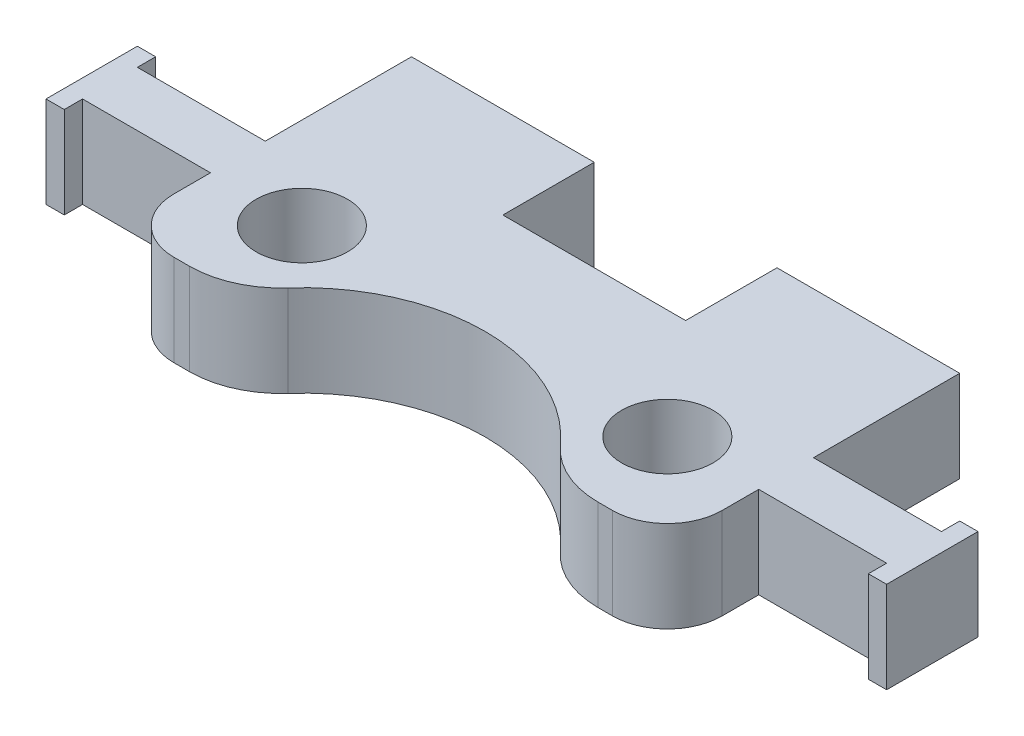
ISO-10303-21;
HEADER;
FILE_DESCRIPTION(('STEP AP214'),'2;1');
FILE_NAME('part.step','',(''),(''),'','','');
FILE_SCHEMA(('AUTOMOTIVE_DESIGN { 1 0 10303 214 1 1 1 1 }'));
ENDSEC;
DATA;
#1=APPLICATION_CONTEXT('core data for automotive mechanical design processes');
#2=APPLICATION_PROTOCOL_DEFINITION('international standard','automotive_design',2000,#1);
#3=PRODUCT_CONTEXT('',#1,'mechanical');
#4=PRODUCT('Part','Part','',(#3));
#5=PRODUCT_RELATED_PRODUCT_CATEGORY('part','',(#4));
#6=PRODUCT_DEFINITION_FORMATION('','',#4);
#7=PRODUCT_DEFINITION_CONTEXT('part definition',#1,'design');
#8=PRODUCT_DEFINITION('design','',#6,#7);
#9=PRODUCT_DEFINITION_SHAPE('','',#8);
#10=(LENGTH_UNIT() NAMED_UNIT(*) SI_UNIT(.MILLI.,.METRE.));
#11=(NAMED_UNIT(*) PLANE_ANGLE_UNIT() SI_UNIT($,.RADIAN.));
#12=(NAMED_UNIT(*) SI_UNIT($,.STERADIAN.) SOLID_ANGLE_UNIT());
#13=UNCERTAINTY_MEASURE_WITH_UNIT(LENGTH_MEASURE(1.E-05),#10,'distance_accuracy_value','');
#14=(GEOMETRIC_REPRESENTATION_CONTEXT(3) GLOBAL_UNCERTAINTY_ASSIGNED_CONTEXT((#13)) GLOBAL_UNIT_ASSIGNED_CONTEXT((#10,
#11,#12)) REPRESENTATION_CONTEXT('',''));
#15=CARTESIAN_POINT('',(0.,0.,0.));
#16=DIRECTION('',(0.,0.,1.));
#17=DIRECTION('',(1.,0.,0.));
#18=AXIS2_PLACEMENT_3D('',#15,#16,#17);
#19=CARTESIAN_POINT('',(3.,5.,-8.));
#20=DIRECTION('',(0.,-1.,0.));
#21=DIRECTION('',(0.,0.,-1.));
#22=AXIS2_PLACEMENT_3D('',#19,#20,#21);
#23=PLANE('',#22);
#24=DIRECTION('',(0.,0.,-1.));
#25=VECTOR('',#24,1.);
#26=CARTESIAN_POINT('',(30.,5.,-13.));
#27=LINE('',#26,#25);
#28=CARTESIAN_POINT('',(30.,5.,-13.));
#29=VERTEX_POINT('',#28);
#30=CARTESIAN_POINT('',(30.,5.,-21.));
#31=VERTEX_POINT('',#30);
#32=EDGE_CURVE('E323',#29,#31,#27,.T.);
#33=ORIENTED_EDGE('',*,*,#32,.T.);
#34=DIRECTION('',(-1.,0.,0.));
#35=VECTOR('',#34,1.);
#36=CARTESIAN_POINT('',(20.,5.,-21.));
#37=LINE('',#36,#35);
#38=CARTESIAN_POINT('',(20.,5.,-21.));
#39=VERTEX_POINT('',#38);
#40=EDGE_CURVE('E161',#31,#39,#37,.T.);
#41=ORIENTED_EDGE('',*,*,#40,.T.);
#42=DIRECTION('',(0.,0.,1.));
#43=VECTOR('',#42,1.);
#44=CARTESIAN_POINT('',(20.,5.,-21.));
#45=LINE('',#44,#43);
#46=CARTESIAN_POINT('',(20.,5.,-16.));
#47=VERTEX_POINT('',#46);
#48=EDGE_CURVE('E404',#39,#47,#45,.T.);
#49=ORIENTED_EDGE('',*,*,#48,.T.);
#50=DIRECTION('',(-1.,0.,0.));
#51=VECTOR('',#50,1.);
#52=CARTESIAN_POINT('',(10.,5.,-16.));
#53=LINE('',#52,#51);
#54=CARTESIAN_POINT('',(10.,5.,-16.));
#55=VERTEX_POINT('',#54);
#56=EDGE_CURVE('E423',#47,#55,#53,.T.);
#57=ORIENTED_EDGE('',*,*,#56,.T.);
#58=DIRECTION('',(0.,0.,-1.));
#59=VECTOR('',#58,1.);
#60=CARTESIAN_POINT('',(10.,5.,-21.));
#61=LINE('',#60,#59);
#62=CARTESIAN_POINT('',(10.,5.,-21.));
#63=VERTEX_POINT('',#62);
#64=EDGE_CURVE('E420',#55,#63,#61,.T.);
#65=ORIENTED_EDGE('',*,*,#64,.T.);
#66=DIRECTION('',(-1.,0.,0.));
#67=VECTOR('',#66,1.);
#68=CARTESIAN_POINT('',(0.,5.,-21.));
#69=LINE('',#68,#67);
#70=CARTESIAN_POINT('',(0.,5.,-21.));
#71=VERTEX_POINT('',#70);
#72=EDGE_CURVE('E422',#63,#71,#69,.T.);
#73=ORIENTED_EDGE('',*,*,#72,.T.);
#74=DIRECTION('',(0.,0.,1.));
#75=VECTOR('',#74,1.);
#76=CARTESIAN_POINT('',(0.,5.,-13.));
#77=LINE('',#76,#75);
#78=CARTESIAN_POINT('',(0.,5.,-13.));
#79=VERTEX_POINT('',#78);
#80=EDGE_CURVE('E425',#71,#79,#77,.T.);
#81=ORIENTED_EDGE('',*,*,#80,.T.);
#82=DIRECTION('',(-1.,0.,0.));
#83=VECTOR('',#82,1.);
#84=CARTESIAN_POINT('',(-7.,5.,-13.));
#85=LINE('',#84,#83);
#86=CARTESIAN_POINT('',(-7.,5.,-13.));
#87=VERTEX_POINT('',#86);
#88=EDGE_CURVE('E431',#79,#87,#85,.T.);
#89=ORIENTED_EDGE('',*,*,#88,.T.);
#90=DIRECTION('',(0.,0.,-1.));
#91=VECTOR('',#90,1.);
#92=CARTESIAN_POINT('',(-7.,5.,-14.));
#93=LINE('',#92,#91);
#94=CARTESIAN_POINT('',(-7.,5.,-14.));
#95=VERTEX_POINT('',#94);
#96=EDGE_CURVE('E433',#87,#95,#93,.T.);
#97=ORIENTED_EDGE('',*,*,#96,.T.);
#98=DIRECTION('',(-1.,0.,0.));
#99=VECTOR('',#98,1.);
#100=CARTESIAN_POINT('',(-8.,5.,-14.));
#101=LINE('',#100,#99);
#102=CARTESIAN_POINT('',(-8.,5.,-14.));
#103=VERTEX_POINT('',#102);
#104=EDGE_CURVE('E435',#95,#103,#101,.T.);
#105=ORIENTED_EDGE('',*,*,#104,.T.);
#106=DIRECTION('',(0.,0.,1.));
#107=VECTOR('',#106,1.);
#108=CARTESIAN_POINT('',(-8.,5.,-9.));
#109=LINE('',#108,#107);
#110=CARTESIAN_POINT('',(-8.,5.,-9.));
#111=VERTEX_POINT('',#110);
#112=EDGE_CURVE('E437',#103,#111,#109,.T.);
#113=ORIENTED_EDGE('',*,*,#112,.T.);
#114=DIRECTION('',(1.,0.,0.));
#115=VECTOR('',#114,1.);
#116=CARTESIAN_POINT('',(-7.,5.,-9.));
#117=LINE('',#116,#115);
#118=CARTESIAN_POINT('',(-7.,5.,-9.));
#119=VERTEX_POINT('',#118);
#120=EDGE_CURVE('E439',#111,#119,#117,.T.);
#121=ORIENTED_EDGE('',*,*,#120,.T.);
#122=DIRECTION('',(0.,0.,-1.));
#123=VECTOR('',#122,1.);
#124=CARTESIAN_POINT('',(-7.,5.,-10.));
#125=LINE('',#124,#123);
#126=CARTESIAN_POINT('',(-7.,5.,-10.));
#127=VERTEX_POINT('',#126);
#128=EDGE_CURVE('E441',#119,#127,#125,.T.);
#129=ORIENTED_EDGE('',*,*,#128,.T.);
#130=DIRECTION('',(1.,0.,0.));
#131=VECTOR('',#130,1.);
#132=CARTESIAN_POINT('',(0.,5.,-10.));
#133=LINE('',#132,#131);
#134=CARTESIAN_POINT('',(0.,5.,-10.));
#135=VERTEX_POINT('',#134);
#136=EDGE_CURVE('E443',#127,#135,#133,.T.);
#137=ORIENTED_EDGE('',*,*,#136,.T.);
#138=DIRECTION('',(0.,0.,1.));
#139=VECTOR('',#138,1.);
#140=CARTESIAN_POINT('',(0.,5.,-8.00000000000002));
#141=LINE('',#140,#139);
#142=CARTESIAN_POINT('',(0.,5.,-8.00000000000002));
#143=VERTEX_POINT('',#142);
#144=EDGE_CURVE('E445',#135,#143,#141,.T.);
#145=ORIENTED_EDGE('',*,*,#144,.T.);
#146=CARTESIAN_POINT('',(3.,5.,-8.));
#147=DIRECTION('',(0.,1.,0.));
#148=DIRECTION('',(0.,0.,-1.));
#149=AXIS2_PLACEMENT_3D('',#146,#147,#148);
#150=CIRCLE('',#149,3.);
#151=CARTESIAN_POINT('',(3.00000000000002,5.,-5.));
#152=VERTEX_POINT('',#151);
#153=EDGE_CURVE('E447',#143,#152,#150,.T.);
#154=ORIENTED_EDGE('',*,*,#153,.T.);
#155=DIRECTION('',(1.,0.,0.));
#156=VECTOR('',#155,1.);
#157=CARTESIAN_POINT('',(3.00000000000002,5.,-5.));
#158=LINE('',#157,#156);
#159=CARTESIAN_POINT('',(3.8456798179791,5.,-5.));
#160=VERTEX_POINT('',#159);
#161=EDGE_CURVE('E449',#152,#160,#158,.T.);
#162=ORIENTED_EDGE('',*,*,#161,.T.);
#163=CARTESIAN_POINT('',(3.8456798179791,5.,-10.));
#164=DIRECTION('',(0.,1.,0.));
#165=DIRECTION('',(0.,0.,1.));
#166=AXIS2_PLACEMENT_3D('',#163,#164,#165);
#167=CIRCLE('',#166,5.);
#168=CARTESIAN_POINT('',(7.57245978047875,5.,-6.66666666666666));
#169=VERTEX_POINT('',#168);
#170=EDGE_CURVE('E451',#160,#169,#167,.T.);
#171=ORIENTED_EDGE('',*,*,#170,.T.);
#172=CARTESIAN_POINT('',(15.0260197054781,5.,0.));
#173=DIRECTION('',(0.,-1.,0.));
#174=DIRECTION('',(0.,0.,1.));
#175=AXIS2_PLACEMENT_3D('',#172,#173,#174);
#176=CIRCLE('',#175,10.);
#177=CARTESIAN_POINT('',(22.4795796304774,5.,-6.66666666666666));
#178=VERTEX_POINT('',#177);
#179=EDGE_CURVE('E453',#169,#178,#176,.T.);
#180=ORIENTED_EDGE('',*,*,#179,.T.);
#181=CARTESIAN_POINT('',(26.206359592977,5.,-10.));
#182=DIRECTION('',(0.,1.,0.));
#183=DIRECTION('',(0.,0.,-1.));
#184=AXIS2_PLACEMENT_3D('',#181,#182,#183);
#185=CIRCLE('',#184,5.);
#186=CARTESIAN_POINT('',(26.206359592977,5.,-5.));
#187=VERTEX_POINT('',#186);
#188=EDGE_CURVE('E455',#178,#187,#185,.T.);
#189=ORIENTED_EDGE('',*,*,#188,.T.);
#190=DIRECTION('',(1.,0.,0.));
#191=VECTOR('',#190,1.);
#192=CARTESIAN_POINT('',(26.206359592977,5.,-5.));
#193=LINE('',#192,#191);
#194=CARTESIAN_POINT('',(27.,5.,-5.));
#195=VERTEX_POINT('',#194);
#196=EDGE_CURVE('E457',#187,#195,#193,.T.);
#197=ORIENTED_EDGE('',*,*,#196,.T.);
#198=CARTESIAN_POINT('',(27.,5.,-8.));
#199=DIRECTION('',(0.,1.,0.));
#200=DIRECTION('',(0.,0.,1.));
#201=AXIS2_PLACEMENT_3D('',#198,#199,#200);
#202=CIRCLE('',#201,3.);
#203=CARTESIAN_POINT('',(30.,5.,-8.00000000000002));
#204=VERTEX_POINT('',#203);
#205=EDGE_CURVE('E459',#195,#204,#202,.T.);
#206=ORIENTED_EDGE('',*,*,#205,.T.);
#207=DIRECTION('',(0.,0.,-1.));
#208=VECTOR('',#207,1.);
#209=CARTESIAN_POINT('',(30.,5.,-8.00000000000002));
#210=LINE('',#209,#208);
#211=CARTESIAN_POINT('',(30.,5.,-10.));
#212=VERTEX_POINT('',#211);
#213=EDGE_CURVE('E461',#204,#212,#210,.T.);
#214=ORIENTED_EDGE('',*,*,#213,.T.);
#215=DIRECTION('',(1.,0.,0.));
#216=VECTOR('',#215,1.);
#217=CARTESIAN_POINT('',(30.,5.,-10.));
#218=LINE('',#217,#216);
#219=CARTESIAN_POINT('',(37.,5.,-10.));
#220=VERTEX_POINT('',#219);
#221=EDGE_CURVE('E463',#212,#220,#218,.T.);
#222=ORIENTED_EDGE('',*,*,#221,.T.);
#223=DIRECTION('',(0.,0.,1.));
#224=VECTOR('',#223,1.);
#225=CARTESIAN_POINT('',(37.,5.,-10.));
#226=LINE('',#225,#224);
#227=CARTESIAN_POINT('',(37.,5.,-9.));
#228=VERTEX_POINT('',#227);
#229=EDGE_CURVE('E465',#220,#228,#226,.T.);
#230=ORIENTED_EDGE('',*,*,#229,.T.);
#231=DIRECTION('',(1.,0.,0.));
#232=VECTOR('',#231,1.);
#233=CARTESIAN_POINT('',(37.,5.,-9.));
#234=LINE('',#233,#232);
#235=CARTESIAN_POINT('',(38.,5.,-9.));
#236=VERTEX_POINT('',#235);
#237=EDGE_CURVE('E467',#228,#236,#234,.T.);
#238=ORIENTED_EDGE('',*,*,#237,.T.);
#239=DIRECTION('',(0.,0.,-1.));
#240=VECTOR('',#239,1.);
#241=CARTESIAN_POINT('',(38.,5.,-9.));
#242=LINE('',#241,#240);
#243=CARTESIAN_POINT('',(38.,5.,-14.));
#244=VERTEX_POINT('',#243);
#245=EDGE_CURVE('E246',#236,#244,#242,.T.);
#246=ORIENTED_EDGE('',*,*,#245,.T.);
#247=DIRECTION('',(-1.,0.,0.));
#248=VECTOR('',#247,1.);
#249=CARTESIAN_POINT('',(38.,5.,-14.));
#250=LINE('',#249,#248);
#251=CARTESIAN_POINT('',(37.,5.,-14.));
#252=VERTEX_POINT('',#251);
#253=EDGE_CURVE('E240',#244,#252,#250,.T.);
#254=ORIENTED_EDGE('',*,*,#253,.T.);
#255=DIRECTION('',(0.,0.,1.));
#256=VECTOR('',#255,1.);
#257=CARTESIAN_POINT('',(37.,5.,-14.));
#258=LINE('',#257,#256);
#259=CARTESIAN_POINT('',(37.,5.,-13.));
#260=VERTEX_POINT('',#259);
#261=EDGE_CURVE('E244',#252,#260,#258,.T.);
#262=ORIENTED_EDGE('',*,*,#261,.T.);
#263=DIRECTION('',(-1.,0.,0.));
#264=VECTOR('',#263,1.);
#265=CARTESIAN_POINT('',(37.,5.,-13.));
#266=LINE('',#265,#264);
#267=EDGE_CURVE('E52',#260,#29,#266,.T.);
#268=ORIENTED_EDGE('',*,*,#267,.T.);
#269=EDGE_LOOP('',(#33,#41,#49,#57,#65,#73,#81,#89,#97,#105,#113,#121,#129,#137,#145,#154,#162,
#171,#180,#189,#197,#206,#214,#222,#230,#238,#246,#254,#262,#268));
#270=FACE_BOUND('',#269,.T.);
#271=CARTESIAN_POINT('',(5.,5.,-10.));
#272=DIRECTION('',(0.,1.,0.));
#273=DIRECTION('',(0.,0.,1.));
#274=AXIS2_PLACEMENT_3D('',#271,#272,#273);
#275=CIRCLE('',#274,2.5);
#276=CARTESIAN_POINT('',(5.,5.,-7.5));
#277=VERTEX_POINT('',#276);
#278=EDGE_CURVE('E268',#277,#277,#275,.T.);
#279=ORIENTED_EDGE('',*,*,#278,.F.);
#280=EDGE_LOOP('',(#279));
#281=FACE_BOUND('',#280,.T.);
#282=CARTESIAN_POINT('',(25.,5.,-10.));
#283=DIRECTION('',(0.,1.,0.));
#284=DIRECTION('',(0.,0.,1.));
#285=AXIS2_PLACEMENT_3D('',#282,#283,#284);
#286=CIRCLE('',#285,2.5);
#287=CARTESIAN_POINT('',(25.,5.,-7.5));
#288=VERTEX_POINT('',#287);
#289=EDGE_CURVE('E508',#288,#288,#286,.T.);
#290=ORIENTED_EDGE('',*,*,#289,.F.);
#291=EDGE_LOOP('',(#290));
#292=FACE_BOUND('',#291,.T.);
#293=ADVANCED_FACE('F35',(#270,#281,#292),#23,.F.);
#294=CARTESIAN_POINT('',(3.,0.,-8.));
#295=DIRECTION('',(0.,-1.,0.));
#296=DIRECTION('',(0.,0.,-1.));
#297=AXIS2_PLACEMENT_3D('',#294,#295,#296);
#298=PLANE('',#297);
#299=CARTESIAN_POINT('',(5.,0.,-10.));
#300=DIRECTION('',(0.,1.,0.));
#301=DIRECTION('',(0.,0.,1.));
#302=AXIS2_PLACEMENT_3D('',#299,#300,#301);
#303=CIRCLE('',#302,2.5);
#304=CARTESIAN_POINT('',(5.,0.,-7.5));
#305=VERTEX_POINT('',#304);
#306=EDGE_CURVE('E513',#305,#305,#303,.T.);
#307=ORIENTED_EDGE('',*,*,#306,.T.);
#308=EDGE_LOOP('',(#307));
#309=FACE_BOUND('',#308,.T.);
#310=DIRECTION('',(0.,0.,-1.));
#311=VECTOR('',#310,1.);
#312=CARTESIAN_POINT('',(30.,0.,-13.));
#313=LINE('',#312,#311);
#314=CARTESIAN_POINT('',(30.,0.,-13.));
#315=VERTEX_POINT('',#314);
#316=CARTESIAN_POINT('',(30.,0.,-21.));
#317=VERTEX_POINT('',#316);
#318=EDGE_CURVE('E264',#315,#317,#313,.T.);
#319=ORIENTED_EDGE('',*,*,#318,.F.);
#320=DIRECTION('',(-1.,0.,0.));
#321=VECTOR('',#320,1.);
#322=CARTESIAN_POINT('',(37.,0.,-13.));
#323=LINE('',#322,#321);
#324=CARTESIAN_POINT('',(37.,0.,-13.));
#325=VERTEX_POINT('',#324);
#326=EDGE_CURVE('E153',#325,#315,#323,.T.);
#327=ORIENTED_EDGE('',*,*,#326,.F.);
#328=DIRECTION('',(0.,0.,1.));
#329=VECTOR('',#328,1.);
#330=CARTESIAN_POINT('',(37.,0.,-14.));
#331=LINE('',#330,#329);
#332=CARTESIAN_POINT('',(37.,0.,-14.));
#333=VERTEX_POINT('',#332);
#334=EDGE_CURVE('E147',#333,#325,#331,.T.);
#335=ORIENTED_EDGE('',*,*,#334,.F.);
#336=DIRECTION('',(-1.,0.,0.));
#337=VECTOR('',#336,1.);
#338=CARTESIAN_POINT('',(38.,0.,-14.));
#339=LINE('',#338,#337);
#340=CARTESIAN_POINT('',(38.,0.,-14.));
#341=VERTEX_POINT('',#340);
#342=EDGE_CURVE('E254',#341,#333,#339,.T.);
#343=ORIENTED_EDGE('',*,*,#342,.F.);
#344=DIRECTION('',(0.,0.,-1.));
#345=VECTOR('',#344,1.);
#346=CARTESIAN_POINT('',(38.,0.,-9.));
#347=LINE('',#346,#345);
#348=CARTESIAN_POINT('',(38.,0.,-9.));
#349=VERTEX_POINT('',#348);
#350=EDGE_CURVE('E318',#349,#341,#347,.T.);
#351=ORIENTED_EDGE('',*,*,#350,.F.);
#352=DIRECTION('',(1.,0.,0.));
#353=VECTOR('',#352,1.);
#354=CARTESIAN_POINT('',(37.,0.,-9.));
#355=LINE('',#354,#353);
#356=CARTESIAN_POINT('',(37.,0.,-9.));
#357=VERTEX_POINT('',#356);
#358=EDGE_CURVE('E316',#357,#349,#355,.T.);
#359=ORIENTED_EDGE('',*,*,#358,.F.);
#360=DIRECTION('',(0.,0.,1.));
#361=VECTOR('',#360,1.);
#362=CARTESIAN_POINT('',(37.,0.,-10.));
#363=LINE('',#362,#361);
#364=CARTESIAN_POINT('',(37.,0.,-10.));
#365=VERTEX_POINT('',#364);
#366=EDGE_CURVE('E314',#365,#357,#363,.T.);
#367=ORIENTED_EDGE('',*,*,#366,.F.);
#368=DIRECTION('',(1.,0.,0.));
#369=VECTOR('',#368,1.);
#370=CARTESIAN_POINT('',(30.,0.,-10.));
#371=LINE('',#370,#369);
#372=CARTESIAN_POINT('',(30.,0.,-10.));
#373=VERTEX_POINT('',#372);
#374=EDGE_CURVE('E312',#373,#365,#371,.T.);
#375=ORIENTED_EDGE('',*,*,#374,.F.);
#376=DIRECTION('',(0.,0.,-1.));
#377=VECTOR('',#376,1.);
#378=CARTESIAN_POINT('',(30.,0.,-8.00000000000002));
#379=LINE('',#378,#377);
#380=CARTESIAN_POINT('',(30.,0.,-8.00000000000002));
#381=VERTEX_POINT('',#380);
#382=EDGE_CURVE('E310',#381,#373,#379,.T.);
#383=ORIENTED_EDGE('',*,*,#382,.F.);
#384=CARTESIAN_POINT('',(27.,0.,-8.));
#385=DIRECTION('',(0.,1.,0.));
#386=DIRECTION('',(0.,0.,1.));
#387=AXIS2_PLACEMENT_3D('',#384,#385,#386);
#388=CIRCLE('',#387,3.);
#389=CARTESIAN_POINT('',(27.,0.,-5.));
#390=VERTEX_POINT('',#389);
#391=EDGE_CURVE('E308',#390,#381,#388,.T.);
#392=ORIENTED_EDGE('',*,*,#391,.F.);
#393=DIRECTION('',(1.,0.,0.));
#394=VECTOR('',#393,1.);
#395=CARTESIAN_POINT('',(26.206359592977,0.,-5.));
#396=LINE('',#395,#394);
#397=CARTESIAN_POINT('',(26.206359592977,0.,-5.));
#398=VERTEX_POINT('',#397);
#399=EDGE_CURVE('E306',#398,#390,#396,.T.);
#400=ORIENTED_EDGE('',*,*,#399,.F.);
#401=CARTESIAN_POINT('',(26.206359592977,0.,-10.));
#402=DIRECTION('',(0.,1.,0.));
#403=DIRECTION('',(0.,0.,-1.));
#404=AXIS2_PLACEMENT_3D('',#401,#402,#403);
#405=CIRCLE('',#404,5.);
#406=CARTESIAN_POINT('',(22.4795796304774,0.,-6.66666666666666));
#407=VERTEX_POINT('',#406);
#408=EDGE_CURVE('E304',#407,#398,#405,.T.);
#409=ORIENTED_EDGE('',*,*,#408,.F.);
#410=CARTESIAN_POINT('',(15.0260197054781,0.,0.));
#411=DIRECTION('',(0.,-1.,0.));
#412=DIRECTION('',(0.,0.,1.));
#413=AXIS2_PLACEMENT_3D('',#410,#411,#412);
#414=CIRCLE('',#413,10.);
#415=CARTESIAN_POINT('',(7.57245978047875,0.,-6.66666666666666));
#416=VERTEX_POINT('',#415);
#417=EDGE_CURVE('E302',#416,#407,#414,.T.);
#418=ORIENTED_EDGE('',*,*,#417,.F.);
#419=CARTESIAN_POINT('',(3.8456798179791,0.,-10.));
#420=DIRECTION('',(0.,1.,0.));
#421=DIRECTION('',(0.,0.,1.));
#422=AXIS2_PLACEMENT_3D('',#419,#420,#421);
#423=CIRCLE('',#422,5.);
#424=CARTESIAN_POINT('',(3.8456798179791,0.,-5.));
#425=VERTEX_POINT('',#424);
#426=EDGE_CURVE('E300',#425,#416,#423,.T.);
#427=ORIENTED_EDGE('',*,*,#426,.F.);
#428=DIRECTION('',(1.,0.,0.));
#429=VECTOR('',#428,1.);
#430=CARTESIAN_POINT('',(3.00000000000002,0.,-5.));
#431=LINE('',#430,#429);
#432=CARTESIAN_POINT('',(3.00000000000002,0.,-5.));
#433=VERTEX_POINT('',#432);
#434=EDGE_CURVE('E298',#433,#425,#431,.T.);
#435=ORIENTED_EDGE('',*,*,#434,.F.);
#436=CARTESIAN_POINT('',(3.,0.,-8.));
#437=DIRECTION('',(0.,1.,0.));
#438=DIRECTION('',(0.,0.,-1.));
#439=AXIS2_PLACEMENT_3D('',#436,#437,#438);
#440=CIRCLE('',#439,3.);
#441=CARTESIAN_POINT('',(0.,0.,-8.00000000000002));
#442=VERTEX_POINT('',#441);
#443=EDGE_CURVE('E296',#442,#433,#440,.T.);
#444=ORIENTED_EDGE('',*,*,#443,.F.);
#445=DIRECTION('',(0.,0.,1.));
#446=VECTOR('',#445,1.);
#447=CARTESIAN_POINT('',(0.,0.,-8.00000000000002));
#448=LINE('',#447,#446);
#449=CARTESIAN_POINT('',(0.,0.,-10.));
#450=VERTEX_POINT('',#449);
#451=EDGE_CURVE('E294',#450,#442,#448,.T.);
#452=ORIENTED_EDGE('',*,*,#451,.F.);
#453=DIRECTION('',(1.,0.,0.));
#454=VECTOR('',#453,1.);
#455=CARTESIAN_POINT('',(0.,0.,-10.));
#456=LINE('',#455,#454);
#457=CARTESIAN_POINT('',(-7.,0.,-10.));
#458=VERTEX_POINT('',#457);
#459=EDGE_CURVE('E292',#458,#450,#456,.T.);
#460=ORIENTED_EDGE('',*,*,#459,.F.);
#461=DIRECTION('',(0.,0.,-1.));
#462=VECTOR('',#461,1.);
#463=CARTESIAN_POINT('',(-7.,0.,-10.));
#464=LINE('',#463,#462);
#465=CARTESIAN_POINT('',(-7.,0.,-9.));
#466=VERTEX_POINT('',#465);
#467=EDGE_CURVE('E290',#466,#458,#464,.T.);
#468=ORIENTED_EDGE('',*,*,#467,.F.);
#469=DIRECTION('',(1.,0.,0.));
#470=VECTOR('',#469,1.);
#471=CARTESIAN_POINT('',(-7.,0.,-9.));
#472=LINE('',#471,#470);
#473=CARTESIAN_POINT('',(-8.,0.,-9.));
#474=VERTEX_POINT('',#473);
#475=EDGE_CURVE('E288',#474,#466,#472,.T.);
#476=ORIENTED_EDGE('',*,*,#475,.F.);
#477=DIRECTION('',(0.,0.,1.));
#478=VECTOR('',#477,1.);
#479=CARTESIAN_POINT('',(-8.,0.,-9.));
#480=LINE('',#479,#478);
#481=CARTESIAN_POINT('',(-8.,0.,-14.));
#482=VERTEX_POINT('',#481);
#483=EDGE_CURVE('E286',#482,#474,#480,.T.);
#484=ORIENTED_EDGE('',*,*,#483,.F.);
#485=DIRECTION('',(-1.,0.,0.));
#486=VECTOR('',#485,1.);
#487=CARTESIAN_POINT('',(-8.,0.,-14.));
#488=LINE('',#487,#486);
#489=CARTESIAN_POINT('',(-7.,0.,-14.));
#490=VERTEX_POINT('',#489);
#491=EDGE_CURVE('E284',#490,#482,#488,.T.);
#492=ORIENTED_EDGE('',*,*,#491,.F.);
#493=DIRECTION('',(0.,0.,-1.));
#494=VECTOR('',#493,1.);
#495=CARTESIAN_POINT('',(-7.,0.,-14.));
#496=LINE('',#495,#494);
#497=CARTESIAN_POINT('',(-7.,0.,-13.));
#498=VERTEX_POINT('',#497);
#499=EDGE_CURVE('E282',#498,#490,#496,.T.);
#500=ORIENTED_EDGE('',*,*,#499,.F.);
#501=DIRECTION('',(-1.,0.,0.));
#502=VECTOR('',#501,1.);
#503=CARTESIAN_POINT('',(-7.,0.,-13.));
#504=LINE('',#503,#502);
#505=CARTESIAN_POINT('',(0.,0.,-13.));
#506=VERTEX_POINT('',#505);
#507=EDGE_CURVE('E280',#506,#498,#504,.T.);
#508=ORIENTED_EDGE('',*,*,#507,.F.);
#509=DIRECTION('',(0.,0.,1.));
#510=VECTOR('',#509,1.);
#511=CARTESIAN_POINT('',(0.,0.,-13.));
#512=LINE('',#511,#510);
#513=CARTESIAN_POINT('',(0.,0.,-21.));
#514=VERTEX_POINT('',#513);
#515=EDGE_CURVE('E278',#514,#506,#512,.T.);
#516=ORIENTED_EDGE('',*,*,#515,.F.);
#517=DIRECTION('',(-1.,0.,0.));
#518=VECTOR('',#517,1.);
#519=CARTESIAN_POINT('',(0.,0.,-21.));
#520=LINE('',#519,#518);
#521=CARTESIAN_POINT('',(10.,0.,-21.));
#522=VERTEX_POINT('',#521);
#523=EDGE_CURVE('E276',#522,#514,#520,.T.);
#524=ORIENTED_EDGE('',*,*,#523,.F.);
#525=DIRECTION('',(0.,0.,-1.));
#526=VECTOR('',#525,1.);
#527=CARTESIAN_POINT('',(10.,0.,-21.));
#528=LINE('',#527,#526);
#529=CARTESIAN_POINT('',(10.,0.,-16.));
#530=VERTEX_POINT('',#529);
#531=EDGE_CURVE('E274',#530,#522,#528,.T.);
#532=ORIENTED_EDGE('',*,*,#531,.F.);
#533=DIRECTION('',(-1.,0.,0.));
#534=VECTOR('',#533,1.);
#535=CARTESIAN_POINT('',(10.,0.,-16.));
#536=LINE('',#535,#534);
#537=CARTESIAN_POINT('',(20.,0.,-16.));
#538=VERTEX_POINT('',#537);
#539=EDGE_CURVE('E272',#538,#530,#536,.T.);
#540=ORIENTED_EDGE('',*,*,#539,.F.);
#541=DIRECTION('',(0.,0.,1.));
#542=VECTOR('',#541,1.);
#543=CARTESIAN_POINT('',(20.,0.,-21.));
#544=LINE('',#543,#542);
#545=CARTESIAN_POINT('',(20.,0.,-21.));
#546=VERTEX_POINT('',#545);
#547=EDGE_CURVE('E270',#546,#538,#544,.T.);
#548=ORIENTED_EDGE('',*,*,#547,.F.);
#549=DIRECTION('',(-1.,0.,0.));
#550=VECTOR('',#549,1.);
#551=CARTESIAN_POINT('',(20.,0.,-21.));
#552=LINE('',#551,#550);
#553=EDGE_CURVE('E267',#317,#546,#552,.T.);
#554=ORIENTED_EDGE('',*,*,#553,.F.);
#555=EDGE_LOOP('',(#319,#327,#335,#343,#351,#359,#367,#375,#383,#392,#400,#409,#418,#427,#435,
#444,#452,#460,#468,#476,#484,#492,#500,#508,#516,#524,#532,#540,#548,#554));
#556=FACE_BOUND('',#555,.T.);
#557=CARTESIAN_POINT('',(25.,0.,-10.));
#558=DIRECTION('',(0.,1.,0.));
#559=DIRECTION('',(0.,0.,1.));
#560=AXIS2_PLACEMENT_3D('',#557,#558,#559);
#561=CIRCLE('',#560,2.5);
#562=CARTESIAN_POINT('',(25.,0.,-7.5));
#563=VERTEX_POINT('',#562);
#564=EDGE_CURVE('E511',#563,#563,#561,.T.);
#565=ORIENTED_EDGE('',*,*,#564,.T.);
#566=EDGE_LOOP('',(#565));
#567=FACE_BOUND('',#566,.T.);
#568=ADVANCED_FACE('F408',(#309,#556,#567),#298,.T.);
#569=CARTESIAN_POINT('',(30.,5.,-13.));
#570=DIRECTION('',(-1.,0.,0.));
#571=DIRECTION('',(0.,0.,1.));
#572=AXIS2_PLACEMENT_3D('',#569,#570,#571);
#573=PLANE('',#572);
#574=ORIENTED_EDGE('',*,*,#318,.T.);
#575=DIRECTION('',(0.,-1.,0.));
#576=VECTOR('',#575,1.);
#577=CARTESIAN_POINT('',(30.,5.,-21.));
#578=LINE('',#577,#576);
#579=EDGE_CURVE('E11',#31,#317,#578,.T.);
#580=ORIENTED_EDGE('',*,*,#579,.F.);
#581=ORIENTED_EDGE('',*,*,#32,.F.);
#582=DIRECTION('',(0.,-1.,0.));
#583=VECTOR('',#582,1.);
#584=CARTESIAN_POINT('',(30.,5.,-13.));
#585=LINE('',#584,#583);
#586=EDGE_CURVE('E260',#29,#315,#585,.T.);
#587=ORIENTED_EDGE('',*,*,#586,.T.);
#588=EDGE_LOOP('',(#574,#580,#581,#587));
#589=FACE_BOUND('',#588,.T.);
#590=ADVANCED_FACE('F37',(#589),#573,.F.);
#591=CARTESIAN_POINT('',(20.,5.,-21.));
#592=DIRECTION('',(0.,0.,1.));
#593=DIRECTION('',(1.,0.,0.));
#594=AXIS2_PLACEMENT_3D('',#591,#592,#593);
#595=PLANE('',#594);
#596=ORIENTED_EDGE('',*,*,#553,.T.);
#597=DIRECTION('',(0.,-1.,0.));
#598=VECTOR('',#597,1.);
#599=CARTESIAN_POINT('',(20.,5.,-21.));
#600=LINE('',#599,#598);
#601=EDGE_CURVE('E44',#39,#546,#600,.T.);
#602=ORIENTED_EDGE('',*,*,#601,.F.);
#603=ORIENTED_EDGE('',*,*,#40,.F.);
#604=ORIENTED_EDGE('',*,*,#579,.T.);
#605=EDGE_LOOP('',(#596,#602,#603,#604));
#606=FACE_BOUND('',#605,.T.);
#607=ADVANCED_FACE('F788',(#606),#595,.F.);
#608=CARTESIAN_POINT('',(20.,5.,-21.));
#609=DIRECTION('',(1.,0.,0.));
#610=DIRECTION('',(0.,0.,-1.));
#611=AXIS2_PLACEMENT_3D('',#608,#609,#610);
#612=PLANE('',#611);
#613=ORIENTED_EDGE('',*,*,#547,.T.);
#614=DIRECTION('',(0.,-1.,0.));
#615=VECTOR('',#614,1.);
#616=CARTESIAN_POINT('',(20.,5.,-16.));
#617=LINE('',#616,#615);
#618=EDGE_CURVE('E396',#47,#538,#617,.T.);
#619=ORIENTED_EDGE('',*,*,#618,.F.);
#620=ORIENTED_EDGE('',*,*,#48,.F.);
#621=ORIENTED_EDGE('',*,*,#601,.T.);
#622=EDGE_LOOP('',(#613,#619,#620,#621));
#623=FACE_BOUND('',#622,.T.);
#624=ADVANCED_FACE('F402',(#623),#612,.F.);
#625=CARTESIAN_POINT('',(10.,5.,-16.));
#626=DIRECTION('',(0.,0.,1.));
#627=DIRECTION('',(1.,0.,0.));
#628=AXIS2_PLACEMENT_3D('',#625,#626,#627);
#629=PLANE('',#628);
#630=ORIENTED_EDGE('',*,*,#539,.T.);
#631=DIRECTION('',(0.,-1.,0.));
#632=VECTOR('',#631,1.);
#633=CARTESIAN_POINT('',(10.,5.,-16.));
#634=LINE('',#633,#632);
#635=EDGE_CURVE('E393',#55,#530,#634,.T.);
#636=ORIENTED_EDGE('',*,*,#635,.F.);
#637=ORIENTED_EDGE('',*,*,#56,.F.);
#638=ORIENTED_EDGE('',*,*,#618,.T.);
#639=EDGE_LOOP('',(#630,#636,#637,#638));
#640=FACE_BOUND('',#639,.T.);
#641=ADVANCED_FACE('F414',(#640),#629,.F.);
#642=CARTESIAN_POINT('',(10.,5.,-21.));
#643=DIRECTION('',(-1.,0.,0.));
#644=DIRECTION('',(0.,0.,1.));
#645=AXIS2_PLACEMENT_3D('',#642,#643,#644);
#646=PLANE('',#645);
#647=ORIENTED_EDGE('',*,*,#531,.T.);
#648=DIRECTION('',(0.,-1.,0.));
#649=VECTOR('',#648,1.);
#650=CARTESIAN_POINT('',(10.,5.,-21.));
#651=LINE('',#650,#649);
#652=EDGE_CURVE('E390',#63,#522,#651,.T.);
#653=ORIENTED_EDGE('',*,*,#652,.F.);
#654=ORIENTED_EDGE('',*,*,#64,.F.);
#655=ORIENTED_EDGE('',*,*,#635,.T.);
#656=EDGE_LOOP('',(#647,#653,#654,#655));
#657=FACE_BOUND('',#656,.T.);
#658=ADVANCED_FACE('F418',(#657),#646,.F.);
#659=CARTESIAN_POINT('',(0.,5.,-21.));
#660=DIRECTION('',(0.,0.,1.));
#661=DIRECTION('',(1.,0.,0.));
#662=AXIS2_PLACEMENT_3D('',#659,#660,#661);
#663=PLANE('',#662);
#664=ORIENTED_EDGE('',*,*,#523,.T.);
#665=DIRECTION('',(0.,-1.,0.));
#666=VECTOR('',#665,1.);
#667=CARTESIAN_POINT('',(0.,5.,-21.));
#668=LINE('',#667,#666);
#669=EDGE_CURVE('E387',#71,#514,#668,.T.);
#670=ORIENTED_EDGE('',*,*,#669,.F.);
#671=ORIENTED_EDGE('',*,*,#72,.F.);
#672=ORIENTED_EDGE('',*,*,#652,.T.);
#673=EDGE_LOOP('',(#664,#670,#671,#672));
#674=FACE_BOUND('',#673,.T.);
#675=ADVANCED_FACE('F753',(#674),#663,.F.);
#676=CARTESIAN_POINT('',(0.,5.,-13.));
#677=DIRECTION('',(1.,0.,0.));
#678=DIRECTION('',(0.,0.,-1.));
#679=AXIS2_PLACEMENT_3D('',#676,#677,#678);
#680=PLANE('',#679);
#681=ORIENTED_EDGE('',*,*,#515,.T.);
#682=DIRECTION('',(0.,-1.,0.));
#683=VECTOR('',#682,1.);
#684=CARTESIAN_POINT('',(0.,5.,-13.));
#685=LINE('',#684,#683);
#686=EDGE_CURVE('E384',#79,#506,#685,.T.);
#687=ORIENTED_EDGE('',*,*,#686,.F.);
#688=ORIENTED_EDGE('',*,*,#80,.F.);
#689=ORIENTED_EDGE('',*,*,#669,.T.);
#690=EDGE_LOOP('',(#681,#687,#688,#689));
#691=FACE_BOUND('',#690,.T.);
#692=ADVANCED_FACE('F743',(#691),#680,.F.);
#693=CARTESIAN_POINT('',(-7.,5.,-13.));
#694=DIRECTION('',(0.,0.,1.));
#695=DIRECTION('',(1.,0.,0.));
#696=AXIS2_PLACEMENT_3D('',#693,#694,#695);
#697=PLANE('',#696);
#698=ORIENTED_EDGE('',*,*,#507,.T.);
#699=DIRECTION('',(0.,-1.,0.));
#700=VECTOR('',#699,1.);
#701=CARTESIAN_POINT('',(-7.,5.,-13.));
#702=LINE('',#701,#700);
#703=EDGE_CURVE('E381',#87,#498,#702,.T.);
#704=ORIENTED_EDGE('',*,*,#703,.F.);
#705=ORIENTED_EDGE('',*,*,#88,.F.);
#706=ORIENTED_EDGE('',*,*,#686,.T.);
#707=EDGE_LOOP('',(#698,#704,#705,#706));
#708=FACE_BOUND('',#707,.T.);
#709=ADVANCED_FACE('F733',(#708),#697,.F.);
#710=CARTESIAN_POINT('',(-7.,5.,-14.));
#711=DIRECTION('',(-1.,0.,0.));
#712=DIRECTION('',(0.,0.,1.));
#713=AXIS2_PLACEMENT_3D('',#710,#711,#712);
#714=PLANE('',#713);
#715=ORIENTED_EDGE('',*,*,#499,.T.);
#716=DIRECTION('',(0.,-1.,0.));
#717=VECTOR('',#716,1.);
#718=CARTESIAN_POINT('',(-7.,5.,-14.));
#719=LINE('',#718,#717);
#720=EDGE_CURVE('E378',#95,#490,#719,.T.);
#721=ORIENTED_EDGE('',*,*,#720,.F.);
#722=ORIENTED_EDGE('',*,*,#96,.F.);
#723=ORIENTED_EDGE('',*,*,#703,.T.);
#724=EDGE_LOOP('',(#715,#721,#722,#723));
#725=FACE_BOUND('',#724,.T.);
#726=ADVANCED_FACE('F723',(#725),#714,.F.);
#727=CARTESIAN_POINT('',(-8.,5.,-14.));
#728=DIRECTION('',(0.,0.,1.));
#729=DIRECTION('',(1.,0.,0.));
#730=AXIS2_PLACEMENT_3D('',#727,#728,#729);
#731=PLANE('',#730);
#732=ORIENTED_EDGE('',*,*,#491,.T.);
#733=DIRECTION('',(0.,-1.,0.));
#734=VECTOR('',#733,1.);
#735=CARTESIAN_POINT('',(-8.,5.,-14.));
#736=LINE('',#735,#734);
#737=EDGE_CURVE('E375',#103,#482,#736,.T.);
#738=ORIENTED_EDGE('',*,*,#737,.F.);
#739=ORIENTED_EDGE('',*,*,#104,.F.);
#740=ORIENTED_EDGE('',*,*,#720,.T.);
#741=EDGE_LOOP('',(#732,#738,#739,#740));
#742=FACE_BOUND('',#741,.T.);
#743=ADVANCED_FACE('F713',(#742),#731,.F.);
#744=CARTESIAN_POINT('',(-8.,5.,-9.));
#745=DIRECTION('',(1.,0.,0.));
#746=DIRECTION('',(0.,0.,-1.));
#747=AXIS2_PLACEMENT_3D('',#744,#745,#746);
#748=PLANE('',#747);
#749=ORIENTED_EDGE('',*,*,#483,.T.);
#750=DIRECTION('',(0.,-1.,0.));
#751=VECTOR('',#750,1.);
#752=CARTESIAN_POINT('',(-8.,5.,-9.));
#753=LINE('',#752,#751);
#754=EDGE_CURVE('E372',#111,#474,#753,.T.);
#755=ORIENTED_EDGE('',*,*,#754,.F.);
#756=ORIENTED_EDGE('',*,*,#112,.F.);
#757=ORIENTED_EDGE('',*,*,#737,.T.);
#758=EDGE_LOOP('',(#749,#755,#756,#757));
#759=FACE_BOUND('',#758,.T.);
#760=ADVANCED_FACE('F703',(#759),#748,.F.);
#761=CARTESIAN_POINT('',(-7.,5.,-9.));
#762=DIRECTION('',(0.,0.,-1.));
#763=DIRECTION('',(-1.,0.,0.));
#764=AXIS2_PLACEMENT_3D('',#761,#762,#763);
#765=PLANE('',#764);
#766=ORIENTED_EDGE('',*,*,#475,.T.);
#767=DIRECTION('',(0.,-1.,0.));
#768=VECTOR('',#767,1.);
#769=CARTESIAN_POINT('',(-7.,5.,-9.));
#770=LINE('',#769,#768);
#771=EDGE_CURVE('E369',#119,#466,#770,.T.);
#772=ORIENTED_EDGE('',*,*,#771,.F.);
#773=ORIENTED_EDGE('',*,*,#120,.F.);
#774=ORIENTED_EDGE('',*,*,#754,.T.);
#775=EDGE_LOOP('',(#766,#772,#773,#774));
#776=FACE_BOUND('',#775,.T.);
#777=ADVANCED_FACE('F693',(#776),#765,.F.);
#778=CARTESIAN_POINT('',(-7.,5.,-10.));
#779=DIRECTION('',(-1.,0.,0.));
#780=DIRECTION('',(0.,0.,1.));
#781=AXIS2_PLACEMENT_3D('',#778,#779,#780);
#782=PLANE('',#781);
#783=ORIENTED_EDGE('',*,*,#467,.T.);
#784=DIRECTION('',(0.,-1.,0.));
#785=VECTOR('',#784,1.);
#786=CARTESIAN_POINT('',(-7.,5.,-10.));
#787=LINE('',#786,#785);
#788=EDGE_CURVE('E366',#127,#458,#787,.T.);
#789=ORIENTED_EDGE('',*,*,#788,.F.);
#790=ORIENTED_EDGE('',*,*,#128,.F.);
#791=ORIENTED_EDGE('',*,*,#771,.T.);
#792=EDGE_LOOP('',(#783,#789,#790,#791));
#793=FACE_BOUND('',#792,.T.);
#794=ADVANCED_FACE('F683',(#793),#782,.F.);
#795=CARTESIAN_POINT('',(0.,5.,-10.));
#796=DIRECTION('',(0.,0.,-1.));
#797=DIRECTION('',(-1.,0.,0.));
#798=AXIS2_PLACEMENT_3D('',#795,#796,#797);
#799=PLANE('',#798);
#800=ORIENTED_EDGE('',*,*,#459,.T.);
#801=DIRECTION('',(0.,-1.,0.));
#802=VECTOR('',#801,1.);
#803=CARTESIAN_POINT('',(0.,5.,-10.));
#804=LINE('',#803,#802);
#805=EDGE_CURVE('E363',#135,#450,#804,.T.);
#806=ORIENTED_EDGE('',*,*,#805,.F.);
#807=ORIENTED_EDGE('',*,*,#136,.F.);
#808=ORIENTED_EDGE('',*,*,#788,.T.);
#809=EDGE_LOOP('',(#800,#806,#807,#808));
#810=FACE_BOUND('',#809,.T.);
#811=ADVANCED_FACE('F673',(#810),#799,.F.);
#812=CARTESIAN_POINT('',(0.,5.,-8.00000000000002));
#813=DIRECTION('',(1.,0.,0.));
#814=DIRECTION('',(0.,0.,-1.));
#815=AXIS2_PLACEMENT_3D('',#812,#813,#814);
#816=PLANE('',#815);
#817=ORIENTED_EDGE('',*,*,#451,.T.);
#818=DIRECTION('',(0.,-1.,0.));
#819=VECTOR('',#818,1.);
#820=CARTESIAN_POINT('',(0.,5.,-8.00000000000002));
#821=LINE('',#820,#819);
#822=EDGE_CURVE('E360',#143,#442,#821,.T.);
#823=ORIENTED_EDGE('',*,*,#822,.F.);
#824=ORIENTED_EDGE('',*,*,#144,.F.);
#825=ORIENTED_EDGE('',*,*,#805,.T.);
#826=EDGE_LOOP('',(#817,#823,#824,#825));
#827=FACE_BOUND('',#826,.T.);
#828=ADVANCED_FACE('F663',(#827),#816,.F.);
#829=CARTESIAN_POINT('',(3.,5.,-8.));
#830=DIRECTION('',(0.,-1.,0.));
#831=DIRECTION('',(0.,0.,-1.));
#832=AXIS2_PLACEMENT_3D('',#829,#830,#831);
#833=CYLINDRICAL_SURFACE('',#832,3.);
#834=ORIENTED_EDGE('',*,*,#443,.T.);
#835=DIRECTION('',(0.,-1.,0.));
#836=VECTOR('',#835,1.);
#837=CARTESIAN_POINT('',(3.00000000000002,5.,-5.));
#838=LINE('',#837,#836);
#839=EDGE_CURVE('E357',#152,#433,#838,.T.);
#840=ORIENTED_EDGE('',*,*,#839,.F.);
#841=ORIENTED_EDGE('',*,*,#153,.F.);
#842=ORIENTED_EDGE('',*,*,#822,.T.);
#843=EDGE_LOOP('',(#834,#840,#841,#842));
#844=FACE_BOUND('',#843,.T.);
#845=ADVANCED_FACE('F653',(#844),#833,.T.);
#846=CARTESIAN_POINT('',(3.00000000000002,5.,-5.));
#847=DIRECTION('',(0.,0.,-1.));
#848=DIRECTION('',(-1.,0.,0.));
#849=AXIS2_PLACEMENT_3D('',#846,#847,#848);
#850=PLANE('',#849);
#851=ORIENTED_EDGE('',*,*,#434,.T.);
#852=DIRECTION('',(0.,-1.,0.));
#853=VECTOR('',#852,1.);
#854=CARTESIAN_POINT('',(3.8456798179791,5.,-5.));
#855=LINE('',#854,#853);
#856=EDGE_CURVE('E354',#160,#425,#855,.T.);
#857=ORIENTED_EDGE('',*,*,#856,.F.);
#858=ORIENTED_EDGE('',*,*,#161,.F.);
#859=ORIENTED_EDGE('',*,*,#839,.T.);
#860=EDGE_LOOP('',(#851,#857,#858,#859));
#861=FACE_BOUND('',#860,.T.);
#862=ADVANCED_FACE('F643',(#861),#850,.F.);
#863=CARTESIAN_POINT('',(3.8456798179791,5.,-10.));
#864=DIRECTION('',(0.,-1.,0.));
#865=DIRECTION('',(0.,0.,-1.));
#866=AXIS2_PLACEMENT_3D('',#863,#864,#865);
#867=CYLINDRICAL_SURFACE('',#866,5.);
#868=ORIENTED_EDGE('',*,*,#426,.T.);
#869=DIRECTION('',(0.,-1.,0.));
#870=VECTOR('',#869,1.);
#871=CARTESIAN_POINT('',(7.57245978047875,5.,-6.66666666666666));
#872=LINE('',#871,#870);
#873=EDGE_CURVE('E351',#169,#416,#872,.T.);
#874=ORIENTED_EDGE('',*,*,#873,.F.);
#875=ORIENTED_EDGE('',*,*,#170,.F.);
#876=ORIENTED_EDGE('',*,*,#856,.T.);
#877=EDGE_LOOP('',(#868,#874,#875,#876));
#878=FACE_BOUND('',#877,.T.);
#879=ADVANCED_FACE('F633',(#878),#867,.T.);
#880=CARTESIAN_POINT('',(15.0260197054781,5.,0.));
#881=DIRECTION('',(0.,-1.,0.));
#882=DIRECTION('',(0.,0.,-1.));
#883=AXIS2_PLACEMENT_3D('',#880,#881,#882);
#884=CYLINDRICAL_SURFACE('',#883,10.);
#885=ORIENTED_EDGE('',*,*,#417,.T.);
#886=DIRECTION('',(0.,-1.,0.));
#887=VECTOR('',#886,1.);
#888=CARTESIAN_POINT('',(22.4795796304774,5.,-6.66666666666666));
#889=LINE('',#888,#887);
#890=EDGE_CURVE('E348',#178,#407,#889,.T.);
#891=ORIENTED_EDGE('',*,*,#890,.F.);
#892=ORIENTED_EDGE('',*,*,#179,.F.);
#893=ORIENTED_EDGE('',*,*,#873,.T.);
#894=EDGE_LOOP('',(#885,#891,#892,#893));
#895=FACE_BOUND('',#894,.T.);
#896=ADVANCED_FACE('F623',(#895),#884,.F.);
#897=CARTESIAN_POINT('',(26.206359592977,5.,-10.));
#898=DIRECTION('',(0.,-1.,0.));
#899=DIRECTION('',(0.,0.,-1.));
#900=AXIS2_PLACEMENT_3D('',#897,#898,#899);
#901=CYLINDRICAL_SURFACE('',#900,5.);
#902=ORIENTED_EDGE('',*,*,#408,.T.);
#903=DIRECTION('',(0.,-1.,0.));
#904=VECTOR('',#903,1.);
#905=CARTESIAN_POINT('',(26.206359592977,5.,-5.));
#906=LINE('',#905,#904);
#907=EDGE_CURVE('E345',#187,#398,#906,.T.);
#908=ORIENTED_EDGE('',*,*,#907,.F.);
#909=ORIENTED_EDGE('',*,*,#188,.F.);
#910=ORIENTED_EDGE('',*,*,#890,.T.);
#911=EDGE_LOOP('',(#902,#908,#909,#910));
#912=FACE_BOUND('',#911,.T.);
#913=ADVANCED_FACE('F613',(#912),#901,.T.);
#914=CARTESIAN_POINT('',(26.206359592977,5.,-5.));
#915=DIRECTION('',(0.,0.,-1.));
#916=DIRECTION('',(-1.,0.,0.));
#917=AXIS2_PLACEMENT_3D('',#914,#915,#916);
#918=PLANE('',#917);
#919=ORIENTED_EDGE('',*,*,#399,.T.);
#920=DIRECTION('',(0.,-1.,0.));
#921=VECTOR('',#920,1.);
#922=CARTESIAN_POINT('',(27.,5.,-5.));
#923=LINE('',#922,#921);
#924=EDGE_CURVE('E342',#195,#390,#923,.T.);
#925=ORIENTED_EDGE('',*,*,#924,.F.);
#926=ORIENTED_EDGE('',*,*,#196,.F.);
#927=ORIENTED_EDGE('',*,*,#907,.T.);
#928=EDGE_LOOP('',(#919,#925,#926,#927));
#929=FACE_BOUND('',#928,.T.);
#930=ADVANCED_FACE('F603',(#929),#918,.F.);
#931=CARTESIAN_POINT('',(27.,5.,-8.));
#932=DIRECTION('',(0.,-1.,0.));
#933=DIRECTION('',(0.,0.,-1.));
#934=AXIS2_PLACEMENT_3D('',#931,#932,#933);
#935=CYLINDRICAL_SURFACE('',#934,3.);
#936=ORIENTED_EDGE('',*,*,#391,.T.);
#937=DIRECTION('',(0.,-1.,0.));
#938=VECTOR('',#937,1.);
#939=CARTESIAN_POINT('',(30.,5.,-8.00000000000002));
#940=LINE('',#939,#938);
#941=EDGE_CURVE('E339',#204,#381,#940,.T.);
#942=ORIENTED_EDGE('',*,*,#941,.F.);
#943=ORIENTED_EDGE('',*,*,#205,.F.);
#944=ORIENTED_EDGE('',*,*,#924,.T.);
#945=EDGE_LOOP('',(#936,#942,#943,#944));
#946=FACE_BOUND('',#945,.T.);
#947=ADVANCED_FACE('F593',(#946),#935,.T.);
#948=CARTESIAN_POINT('',(30.,5.,-8.00000000000002));
#949=DIRECTION('',(-1.,0.,0.));
#950=DIRECTION('',(0.,0.,1.));
#951=AXIS2_PLACEMENT_3D('',#948,#949,#950);
#952=PLANE('',#951);
#953=ORIENTED_EDGE('',*,*,#382,.T.);
#954=DIRECTION('',(0.,-1.,0.));
#955=VECTOR('',#954,1.);
#956=CARTESIAN_POINT('',(30.,5.,-10.));
#957=LINE('',#956,#955);
#958=EDGE_CURVE('E336',#212,#373,#957,.T.);
#959=ORIENTED_EDGE('',*,*,#958,.F.);
#960=ORIENTED_EDGE('',*,*,#213,.F.);
#961=ORIENTED_EDGE('',*,*,#941,.T.);
#962=EDGE_LOOP('',(#953,#959,#960,#961));
#963=FACE_BOUND('',#962,.T.);
#964=ADVANCED_FACE('F583',(#963),#952,.F.);
#965=CARTESIAN_POINT('',(30.,5.,-10.));
#966=DIRECTION('',(0.,0.,-1.));
#967=DIRECTION('',(-1.,0.,0.));
#968=AXIS2_PLACEMENT_3D('',#965,#966,#967);
#969=PLANE('',#968);
#970=ORIENTED_EDGE('',*,*,#374,.T.);
#971=DIRECTION('',(0.,-1.,0.));
#972=VECTOR('',#971,1.);
#973=CARTESIAN_POINT('',(37.,5.,-10.));
#974=LINE('',#973,#972);
#975=EDGE_CURVE('E333',#220,#365,#974,.T.);
#976=ORIENTED_EDGE('',*,*,#975,.F.);
#977=ORIENTED_EDGE('',*,*,#221,.F.);
#978=ORIENTED_EDGE('',*,*,#958,.T.);
#979=EDGE_LOOP('',(#970,#976,#977,#978));
#980=FACE_BOUND('',#979,.T.);
#981=ADVANCED_FACE('F573',(#980),#969,.F.);
#982=CARTESIAN_POINT('',(37.,5.,-10.));
#983=DIRECTION('',(1.,0.,0.));
#984=DIRECTION('',(0.,0.,-1.));
#985=AXIS2_PLACEMENT_3D('',#982,#983,#984);
#986=PLANE('',#985);
#987=ORIENTED_EDGE('',*,*,#366,.T.);
#988=DIRECTION('',(0.,-1.,0.));
#989=VECTOR('',#988,1.);
#990=CARTESIAN_POINT('',(37.,5.,-9.));
#991=LINE('',#990,#989);
#992=EDGE_CURVE('E330',#228,#357,#991,.T.);
#993=ORIENTED_EDGE('',*,*,#992,.F.);
#994=ORIENTED_EDGE('',*,*,#229,.F.);
#995=ORIENTED_EDGE('',*,*,#975,.T.);
#996=EDGE_LOOP('',(#987,#993,#994,#995));
#997=FACE_BOUND('',#996,.T.);
#998=ADVANCED_FACE('F564',(#997),#986,.F.);
#999=CARTESIAN_POINT('',(37.,5.,-9.));
#1000=DIRECTION('',(0.,0.,-1.));
#1001=DIRECTION('',(-1.,0.,0.));
#1002=AXIS2_PLACEMENT_3D('',#999,#1000,#1001);
#1003=PLANE('',#1002);
#1004=ORIENTED_EDGE('',*,*,#358,.T.);
#1005=DIRECTION('',(0.,-1.,0.));
#1006=VECTOR('',#1005,1.);
#1007=CARTESIAN_POINT('',(38.,5.,-9.));
#1008=LINE('',#1007,#1006);
#1009=EDGE_CURVE('E327',#236,#349,#1008,.T.);
#1010=ORIENTED_EDGE('',*,*,#1009,.F.);
#1011=ORIENTED_EDGE('',*,*,#237,.F.);
#1012=ORIENTED_EDGE('',*,*,#992,.T.);
#1013=EDGE_LOOP('',(#1004,#1010,#1011,#1012));
#1014=FACE_BOUND('',#1013,.T.);
#1015=ADVANCED_FACE('F473',(#1014),#1003,.F.);
#1016=CARTESIAN_POINT('',(38.,5.,-9.));
#1017=DIRECTION('',(-1.,0.,0.));
#1018=DIRECTION('',(0.,0.,1.));
#1019=AXIS2_PLACEMENT_3D('',#1016,#1017,#1018);
#1020=PLANE('',#1019);
#1021=ORIENTED_EDGE('',*,*,#350,.T.);
#1022=DIRECTION('',(0.,-1.,0.));
#1023=VECTOR('',#1022,1.);
#1024=CARTESIAN_POINT('',(38.,5.,-14.));
#1025=LINE('',#1024,#1023);
#1026=EDGE_CURVE('E255',#244,#341,#1025,.T.);
#1027=ORIENTED_EDGE('',*,*,#1026,.F.);
#1028=ORIENTED_EDGE('',*,*,#245,.F.);
#1029=ORIENTED_EDGE('',*,*,#1009,.T.);
#1030=EDGE_LOOP('',(#1021,#1027,#1028,#1029));
#1031=FACE_BOUND('',#1030,.T.);
#1032=ADVANCED_FACE('F477',(#1031),#1020,.F.);
#1033=CARTESIAN_POINT('',(38.,5.,-14.));
#1034=DIRECTION('',(0.,0.,1.));
#1035=DIRECTION('',(1.,0.,0.));
#1036=AXIS2_PLACEMENT_3D('',#1033,#1034,#1035);
#1037=PLANE('',#1036);
#1038=ORIENTED_EDGE('',*,*,#342,.T.);
#1039=DIRECTION('',(0.,-1.,0.));
#1040=VECTOR('',#1039,1.);
#1041=CARTESIAN_POINT('',(37.,5.,-14.));
#1042=LINE('',#1041,#1040);
#1043=EDGE_CURVE('E251',#252,#333,#1042,.T.);
#1044=ORIENTED_EDGE('',*,*,#1043,.F.);
#1045=ORIENTED_EDGE('',*,*,#253,.F.);
#1046=ORIENTED_EDGE('',*,*,#1026,.T.);
#1047=EDGE_LOOP('',(#1038,#1044,#1045,#1046));
#1048=FACE_BOUND('',#1047,.T.);
#1049=ADVANCED_FACE('F252',(#1048),#1037,.F.);
#1050=CARTESIAN_POINT('',(37.,5.,-14.));
#1051=DIRECTION('',(1.,0.,0.));
#1052=DIRECTION('',(0.,0.,-1.));
#1053=AXIS2_PLACEMENT_3D('',#1050,#1051,#1052);
#1054=PLANE('',#1053);
#1055=ORIENTED_EDGE('',*,*,#334,.T.);
#1056=DIRECTION('',(0.,-1.,0.));
#1057=VECTOR('',#1056,1.);
#1058=CARTESIAN_POINT('',(37.,5.,-13.));
#1059=LINE('',#1058,#1057);
#1060=EDGE_CURVE('E256',#260,#325,#1059,.T.);
#1061=ORIENTED_EDGE('',*,*,#1060,.F.);
#1062=ORIENTED_EDGE('',*,*,#261,.F.);
#1063=ORIENTED_EDGE('',*,*,#1043,.T.);
#1064=EDGE_LOOP('',(#1055,#1061,#1062,#1063));
#1065=FACE_BOUND('',#1064,.T.);
#1066=ADVANCED_FACE('F258',(#1065),#1054,.F.);
#1067=CARTESIAN_POINT('',(37.,5.,-13.));
#1068=DIRECTION('',(0.,0.,1.));
#1069=DIRECTION('',(1.,0.,0.));
#1070=AXIS2_PLACEMENT_3D('',#1067,#1068,#1069);
#1071=PLANE('',#1070);
#1072=ORIENTED_EDGE('',*,*,#326,.T.);
#1073=ORIENTED_EDGE('',*,*,#586,.F.);
#1074=ORIENTED_EDGE('',*,*,#267,.F.);
#1075=ORIENTED_EDGE('',*,*,#1060,.T.);
#1076=EDGE_LOOP('',(#1072,#1073,#1074,#1075));
#1077=FACE_BOUND('',#1076,.T.);
#1078=ADVANCED_FACE('F481',(#1077),#1071,.F.);
#1079=CARTESIAN_POINT('',(5.,5.,-10.));
#1080=DIRECTION('',(0.,-1.,0.));
#1081=DIRECTION('',(0.,0.,-1.));
#1082=AXIS2_PLACEMENT_3D('',#1079,#1080,#1081);
#1083=CYLINDRICAL_SURFACE('',#1082,2.5);
#1084=ORIENTED_EDGE('',*,*,#278,.T.);
#1085=EDGE_LOOP('',(#1084));
#1086=FACE_BOUND('',#1085,.T.);
#1087=ORIENTED_EDGE('',*,*,#306,.F.);
#1088=EDGE_LOOP('',(#1087));
#1089=FACE_BOUND('',#1088,.T.);
#1090=ADVANCED_FACE('F483',(#1086,#1089),#1083,.F.);
#1091=CARTESIAN_POINT('',(25.,5.,-10.));
#1092=DIRECTION('',(0.,-1.,0.));
#1093=DIRECTION('',(0.,0.,-1.));
#1094=AXIS2_PLACEMENT_3D('',#1091,#1092,#1093);
#1095=CYLINDRICAL_SURFACE('',#1094,2.5);
#1096=ORIENTED_EDGE('',*,*,#289,.T.);
#1097=EDGE_LOOP('',(#1096));
#1098=FACE_BOUND('',#1097,.T.);
#1099=ORIENTED_EDGE('',*,*,#564,.F.);
#1100=EDGE_LOOP('',(#1099));
#1101=FACE_BOUND('',#1100,.T.);
#1102=ADVANCED_FACE('F489',(#1098,#1101),#1095,.F.);
#1103=CLOSED_SHELL('',(#293,#568,#590,#607,#624,#641,#658,#675,#692,#709,#726,#743,#760,#777,
#794,#811,#828,#845,#862,#879,#896,#913,#930,#947,#964,#981,#998,#1015,#1032,#1049,#1066,#1078,
#1090,#1102));
#1104=MANIFOLD_SOLID_BREP('B2',#1103);
#1105=ADVANCED_BREP_SHAPE_REPRESENTATION('',(#18,#1104),#14);
#1106=SHAPE_DEFINITION_REPRESENTATION(#9,#1105);
ENDSEC;
END-ISO-10303-21;
